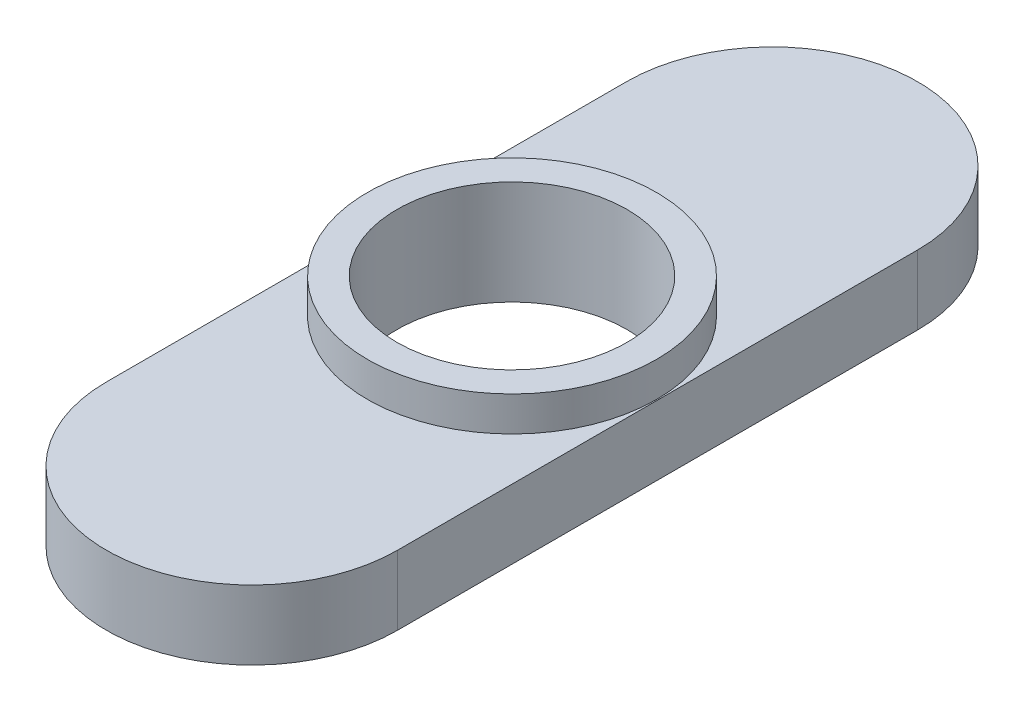
ISO-10303-21;
HEADER;
FILE_DESCRIPTION(('STEP AP214'),'2;1');
FILE_NAME('part.step','',(''),(''),'','','');
FILE_SCHEMA(('AUTOMOTIVE_DESIGN { 1 0 10303 214 1 1 1 1 }'));
ENDSEC;
DATA;
#1=APPLICATION_CONTEXT('core data for automotive mechanical design processes');
#2=APPLICATION_PROTOCOL_DEFINITION('international standard','automotive_design',2000,#1);
#3=PRODUCT_CONTEXT('',#1,'mechanical');
#4=PRODUCT('Part','Part','',(#3));
#5=PRODUCT_RELATED_PRODUCT_CATEGORY('part','',(#4));
#6=PRODUCT_DEFINITION_FORMATION('','',#4);
#7=PRODUCT_DEFINITION_CONTEXT('part definition',#1,'design');
#8=PRODUCT_DEFINITION('design','',#6,#7);
#9=PRODUCT_DEFINITION_SHAPE('','',#8);
#10=(LENGTH_UNIT() NAMED_UNIT(*) SI_UNIT(.MILLI.,.METRE.));
#11=(NAMED_UNIT(*) PLANE_ANGLE_UNIT() SI_UNIT($,.RADIAN.));
#12=(NAMED_UNIT(*) SI_UNIT($,.STERADIAN.) SOLID_ANGLE_UNIT());
#13=UNCERTAINTY_MEASURE_WITH_UNIT(LENGTH_MEASURE(1.E-05),#10,'distance_accuracy_value','');
#14=(GEOMETRIC_REPRESENTATION_CONTEXT(3) GLOBAL_UNCERTAINTY_ASSIGNED_CONTEXT((#13)) GLOBAL_UNIT_ASSIGNED_CONTEXT((#10,
#11,#12)) REPRESENTATION_CONTEXT('',''));
#15=CARTESIAN_POINT('',(0.,0.,0.));
#16=DIRECTION('',(0.,0.,1.));
#17=DIRECTION('',(1.,0.,0.));
#18=AXIS2_PLACEMENT_3D('',#15,#16,#17);
#19=CARTESIAN_POINT('',(0.,2.54,9.525));
#20=DIRECTION('',(0.,1.,0.));
#21=DIRECTION('',(0.,0.,1.));
#22=AXIS2_PLACEMENT_3D('',#19,#20,#21);
#23=PLANE('',#22);
#24=DIRECTION('',(0.,0.,1.));
#25=VECTOR('',#24,1.);
#26=CARTESIAN_POINT('',(5.33399999999999,2.54,-9.525));
#27=LINE('',#26,#25);
#28=CARTESIAN_POINT('',(5.334,2.54,-9.525));
#29=VERTEX_POINT('',#28);
#30=CARTESIAN_POINT('',(5.334,2.54,9.525));
#31=VERTEX_POINT('',#30);
#32=EDGE_CURVE('E114',#29,#31,#27,.T.);
#33=ORIENTED_EDGE('',*,*,#32,.F.);
#34=CARTESIAN_POINT('',(0.,2.54,-9.525));
#35=DIRECTION('',(0.,1.,0.));
#36=DIRECTION('',(0.,0.,1.));
#37=AXIS2_PLACEMENT_3D('',#34,#35,#36);
#38=CIRCLE('',#37,5.334);
#39=CARTESIAN_POINT('',(-5.334,2.54,-9.525));
#40=VERTEX_POINT('',#39);
#41=EDGE_CURVE('E99',#29,#40,#38,.T.);
#42=ORIENTED_EDGE('',*,*,#41,.T.);
#43=DIRECTION('',(0.,0.,1.));
#44=VECTOR('',#43,1.);
#45=CARTESIAN_POINT('',(-5.334,2.54,-9.525));
#46=LINE('',#45,#44);
#47=CARTESIAN_POINT('',(-5.334,2.54,9.525));
#48=VERTEX_POINT('',#47);
#49=EDGE_CURVE('E96',#40,#48,#46,.T.);
#50=ORIENTED_EDGE('',*,*,#49,.T.);
#51=CARTESIAN_POINT('',(0.,2.54,9.525));
#52=DIRECTION('',(0.,1.,0.));
#53=DIRECTION('',(0.,0.,1.));
#54=AXIS2_PLACEMENT_3D('',#51,#52,#53);
#55=CIRCLE('',#54,5.334);
#56=EDGE_CURVE('E93',#48,#31,#55,.T.);
#57=ORIENTED_EDGE('',*,*,#56,.T.);
#58=EDGE_LOOP('',(#33,#42,#50,#57));
#59=FACE_BOUND('',#58,.T.);
#60=CARTESIAN_POINT('',(0.,2.54,0.));
#61=DIRECTION('',(0.,1.,0.));
#62=DIRECTION('',(1.,0.,0.));
#63=AXIS2_PLACEMENT_3D('',#60,#61,#62);
#64=CIRCLE('',#63,5.2959);
#65=CARTESIAN_POINT('',(5.2959,2.54,0.));
#66=VERTEX_POINT('',#65);
#67=EDGE_CURVE('E243',#66,#66,#64,.T.);
#68=ORIENTED_EDGE('',*,*,#67,.F.);
#69=EDGE_LOOP('',(#68));
#70=FACE_BOUND('',#69,.T.);
#71=ADVANCED_FACE('F49',(#59,#70),#23,.T.);
#72=CARTESIAN_POINT('',(5.33399999999999,2.54,-9.525));
#73=DIRECTION('',(1.,0.,0.));
#74=DIRECTION('',(0.,0.,-1.));
#75=AXIS2_PLACEMENT_3D('',#72,#73,#74);
#76=PLANE('',#75);
#77=DIRECTION('',(0.,0.,1.));
#78=VECTOR('',#77,1.);
#79=CARTESIAN_POINT('',(5.33399999999999,0.,-9.525));
#80=LINE('',#79,#78);
#81=CARTESIAN_POINT('',(5.334,0.,-9.525));
#82=VERTEX_POINT('',#81);
#83=CARTESIAN_POINT('',(5.334,0.,9.525));
#84=VERTEX_POINT('',#83);
#85=EDGE_CURVE('E122',#82,#84,#80,.T.);
#86=ORIENTED_EDGE('',*,*,#85,.F.);
#87=DIRECTION('',(0.,-1.,0.));
#88=VECTOR('',#87,1.);
#89=CARTESIAN_POINT('',(5.334,2.54,-9.525));
#90=LINE('',#89,#88);
#91=EDGE_CURVE('E12',#29,#82,#90,.T.);
#92=ORIENTED_EDGE('',*,*,#91,.F.);
#93=ORIENTED_EDGE('',*,*,#32,.T.);
#94=DIRECTION('',(0.,-1.,0.));
#95=VECTOR('',#94,1.);
#96=CARTESIAN_POINT('',(5.334,2.54,9.525));
#97=LINE('',#96,#95);
#98=EDGE_CURVE('E53',#31,#84,#97,.T.);
#99=ORIENTED_EDGE('',*,*,#98,.T.);
#100=EDGE_LOOP('',(#86,#92,#93,#99));
#101=FACE_BOUND('',#100,.T.);
#102=ADVANCED_FACE('F51',(#101),#76,.T.);
#103=CARTESIAN_POINT('',(0.,2.54,-9.525));
#104=DIRECTION('',(0.,-1.,0.));
#105=DIRECTION('',(0.,0.,-1.));
#106=AXIS2_PLACEMENT_3D('',#103,#104,#105);
#107=CYLINDRICAL_SURFACE('',#106,5.334);
#108=CARTESIAN_POINT('',(0.,0.,-9.525));
#109=DIRECTION('',(0.,1.,0.));
#110=DIRECTION('',(0.,0.,1.));
#111=AXIS2_PLACEMENT_3D('',#108,#109,#110);
#112=CIRCLE('',#111,5.334);
#113=CARTESIAN_POINT('',(-5.334,0.,-9.525));
#114=VERTEX_POINT('',#113);
#115=EDGE_CURVE('E84',#82,#114,#112,.T.);
#116=ORIENTED_EDGE('',*,*,#115,.T.);
#117=DIRECTION('',(0.,-1.,0.));
#118=VECTOR('',#117,1.);
#119=CARTESIAN_POINT('',(-5.334,2.54,-9.525));
#120=LINE('',#119,#118);
#121=EDGE_CURVE('E60',#40,#114,#120,.T.);
#122=ORIENTED_EDGE('',*,*,#121,.F.);
#123=ORIENTED_EDGE('',*,*,#41,.F.);
#124=ORIENTED_EDGE('',*,*,#91,.T.);
#125=EDGE_LOOP('',(#116,#122,#123,#124));
#126=FACE_BOUND('',#125,.T.);
#127=ADVANCED_FACE('F139',(#126),#107,.T.);
#128=CARTESIAN_POINT('',(-5.334,2.54,-9.525));
#129=DIRECTION('',(1.,0.,0.));
#130=DIRECTION('',(0.,0.,-1.));
#131=AXIS2_PLACEMENT_3D('',#128,#129,#130);
#132=PLANE('',#131);
#133=DIRECTION('',(0.,0.,1.));
#134=VECTOR('',#133,1.);
#135=CARTESIAN_POINT('',(-5.334,0.,-9.525));
#136=LINE('',#135,#134);
#137=CARTESIAN_POINT('',(-5.334,0.,9.525));
#138=VERTEX_POINT('',#137);
#139=EDGE_CURVE('E107',#114,#138,#136,.T.);
#140=ORIENTED_EDGE('',*,*,#139,.T.);
#141=DIRECTION('',(0.,-1.,0.));
#142=VECTOR('',#141,1.);
#143=CARTESIAN_POINT('',(-5.334,2.54,9.525));
#144=LINE('',#143,#142);
#145=EDGE_CURVE('E104',#48,#138,#144,.T.);
#146=ORIENTED_EDGE('',*,*,#145,.F.);
#147=ORIENTED_EDGE('',*,*,#49,.F.);
#148=ORIENTED_EDGE('',*,*,#121,.T.);
#149=EDGE_LOOP('',(#140,#146,#147,#148));
#150=FACE_BOUND('',#149,.T.);
#151=ADVANCED_FACE('F105',(#150),#132,.F.);
#152=CARTESIAN_POINT('',(0.,2.54,9.525));
#153=DIRECTION('',(0.,-1.,0.));
#154=DIRECTION('',(0.,0.,-1.));
#155=AXIS2_PLACEMENT_3D('',#152,#153,#154);
#156=CYLINDRICAL_SURFACE('',#155,5.334);
#157=CARTESIAN_POINT('',(0.,0.,9.525));
#158=DIRECTION('',(0.,1.,0.));
#159=DIRECTION('',(0.,0.,1.));
#160=AXIS2_PLACEMENT_3D('',#157,#158,#159);
#161=CIRCLE('',#160,5.334);
#162=EDGE_CURVE('E126',#138,#84,#161,.T.);
#163=ORIENTED_EDGE('',*,*,#162,.T.);
#164=ORIENTED_EDGE('',*,*,#98,.F.);
#165=ORIENTED_EDGE('',*,*,#56,.F.);
#166=ORIENTED_EDGE('',*,*,#145,.T.);
#167=EDGE_LOOP('',(#163,#164,#165,#166));
#168=FACE_BOUND('',#167,.T.);
#169=ADVANCED_FACE('F112',(#168),#156,.T.);
#170=CARTESIAN_POINT('',(0.,0.,9.525));
#171=DIRECTION('',(0.,1.,0.));
#172=DIRECTION('',(0.,0.,1.));
#173=AXIS2_PLACEMENT_3D('',#170,#171,#172);
#174=PLANE('',#173);
#175=CARTESIAN_POINT('',(0.,0.,0.));
#176=DIRECTION('',(0.,1.,0.));
#177=DIRECTION('',(0.,0.,1.));
#178=AXIS2_PLACEMENT_3D('',#175,#176,#177);
#179=CIRCLE('',#178,4.2164);
#180=CARTESIAN_POINT('',(0.,0.,4.2164));
#181=VERTEX_POINT('',#180);
#182=EDGE_CURVE('E127',#181,#181,#179,.T.);
#183=ORIENTED_EDGE('',*,*,#182,.T.);
#184=EDGE_LOOP('',(#183));
#185=FACE_BOUND('',#184,.T.);
#186=ORIENTED_EDGE('',*,*,#85,.T.);
#187=ORIENTED_EDGE('',*,*,#162,.F.);
#188=ORIENTED_EDGE('',*,*,#139,.F.);
#189=ORIENTED_EDGE('',*,*,#115,.F.);
#190=EDGE_LOOP('',(#186,#187,#188,#189));
#191=FACE_BOUND('',#190,.T.);
#192=ADVANCED_FACE('F136',(#185,#191),#174,.F.);
#193=CARTESIAN_POINT('',(0.,0.,0.));
#194=DIRECTION('',(0.,1.,0.));
#195=DIRECTION('',(0.,0.,1.));
#196=AXIS2_PLACEMENT_3D('',#193,#194,#195);
#197=CYLINDRICAL_SURFACE('',#196,4.2164);
#198=ORIENTED_EDGE('',*,*,#182,.F.);
#199=EDGE_LOOP('',(#198));
#200=FACE_BOUND('',#199,.T.);
#201=CARTESIAN_POINT('',(0.,3.81,0.));
#202=DIRECTION('',(0.,1.,0.));
#203=DIRECTION('',(0.,0.,1.));
#204=AXIS2_PLACEMENT_3D('',#201,#202,#203);
#205=CIRCLE('',#204,4.2164);
#206=CARTESIAN_POINT('',(0.,3.81,4.2164));
#207=VERTEX_POINT('',#206);
#208=EDGE_CURVE('E245',#207,#207,#205,.T.);
#209=ORIENTED_EDGE('',*,*,#208,.T.);
#210=EDGE_LOOP('',(#209));
#211=FACE_BOUND('',#210,.T.);
#212=ADVANCED_FACE('F150',(#200,#211),#197,.F.);
#213=CARTESIAN_POINT('',(0.,3.81,0.));
#214=DIRECTION('',(0.,1.,0.));
#215=DIRECTION('',(0.,0.,1.));
#216=AXIS2_PLACEMENT_3D('',#213,#214,#215);
#217=PLANE('',#216);
#218=CARTESIAN_POINT('',(0.,3.81,0.));
#219=DIRECTION('',(0.,1.,0.));
#220=DIRECTION('',(1.,0.,0.));
#221=AXIS2_PLACEMENT_3D('',#218,#219,#220);
#222=CIRCLE('',#221,5.2959);
#223=CARTESIAN_POINT('',(5.2959,3.81,0.));
#224=VERTEX_POINT('',#223);
#225=EDGE_CURVE('E240',#224,#224,#222,.T.);
#226=ORIENTED_EDGE('',*,*,#225,.T.);
#227=EDGE_LOOP('',(#226));
#228=FACE_BOUND('',#227,.T.);
#229=ORIENTED_EDGE('',*,*,#208,.F.);
#230=EDGE_LOOP('',(#229));
#231=FACE_BOUND('',#230,.T.);
#232=ADVANCED_FACE('F171',(#228,#231),#217,.T.);
#233=CARTESIAN_POINT('',(0.,3.81,0.));
#234=DIRECTION('',(0.,-1.,0.));
#235=DIRECTION('',(0.,0.,-1.));
#236=AXIS2_PLACEMENT_3D('',#233,#234,#235);
#237=CYLINDRICAL_SURFACE('',#236,5.2959);
#238=ORIENTED_EDGE('',*,*,#225,.F.);
#239=EDGE_LOOP('',(#238));
#240=FACE_BOUND('',#239,.T.);
#241=ORIENTED_EDGE('',*,*,#67,.T.);
#242=EDGE_LOOP('',(#241));
#243=FACE_BOUND('',#242,.T.);
#244=ADVANCED_FACE('F178',(#240,#243),#237,.T.);
#245=CLOSED_SHELL('',(#71,#102,#127,#151,#169,#192,#212,#232,#244));
#246=MANIFOLD_SOLID_BREP('B2',#245);
#247=ADVANCED_BREP_SHAPE_REPRESENTATION('',(#18,#246),#14);
#248=SHAPE_DEFINITION_REPRESENTATION(#9,#247);
ENDSEC;
END-ISO-10303-21;
